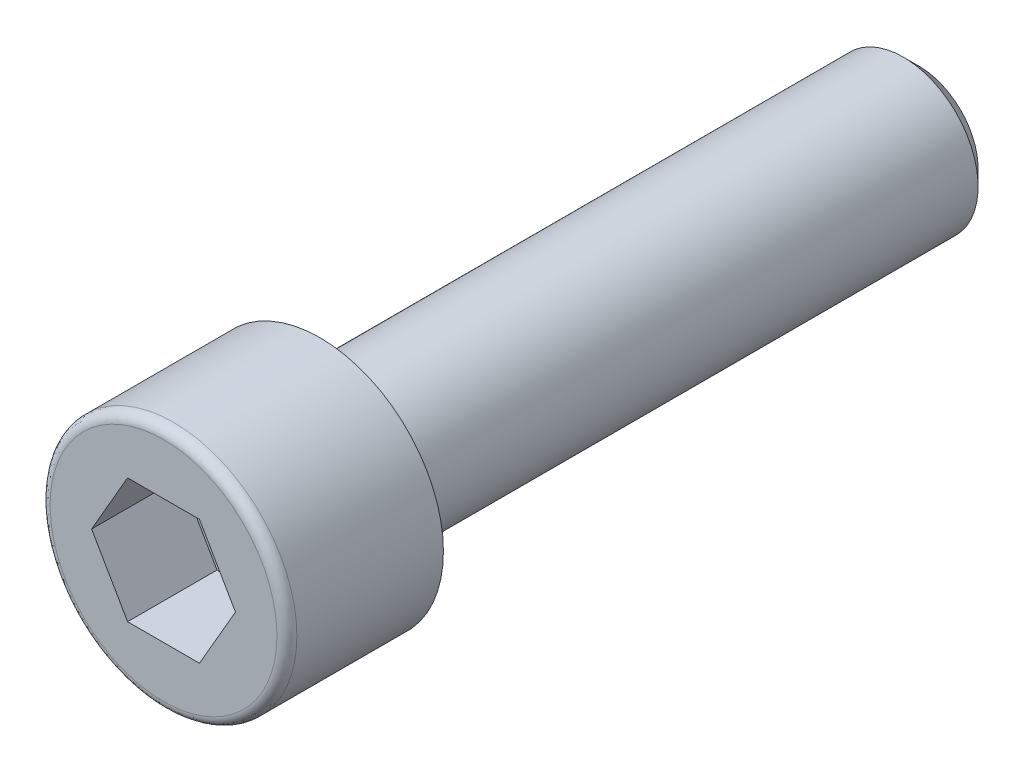
ISO-10303-21;
HEADER;
FILE_DESCRIPTION(('STEP AP214'),'2;1');
FILE_NAME('part.step','',(''),(''),'','','');
FILE_SCHEMA(('AUTOMOTIVE_DESIGN { 1 0 10303 214 1 1 1 1 }'));
ENDSEC;
DATA;
#1=APPLICATION_CONTEXT('core data for automotive mechanical design processes');
#2=APPLICATION_PROTOCOL_DEFINITION('international standard','automotive_design',2000,#1);
#3=PRODUCT_CONTEXT('',#1,'mechanical');
#4=PRODUCT('Part','Part','',(#3));
#5=PRODUCT_RELATED_PRODUCT_CATEGORY('part','',(#4));
#6=PRODUCT_DEFINITION_FORMATION('','',#4);
#7=PRODUCT_DEFINITION_CONTEXT('part definition',#1,'design');
#8=PRODUCT_DEFINITION('design','',#6,#7);
#9=PRODUCT_DEFINITION_SHAPE('','',#8);
#10=(LENGTH_UNIT() NAMED_UNIT(*) SI_UNIT(.MILLI.,.METRE.));
#11=(NAMED_UNIT(*) PLANE_ANGLE_UNIT() SI_UNIT($,.RADIAN.));
#12=(NAMED_UNIT(*) SI_UNIT($,.STERADIAN.) SOLID_ANGLE_UNIT());
#13=UNCERTAINTY_MEASURE_WITH_UNIT(LENGTH_MEASURE(1.E-05),#10,'distance_accuracy_value','');
#14=(GEOMETRIC_REPRESENTATION_CONTEXT(3) GLOBAL_UNCERTAINTY_ASSIGNED_CONTEXT((#13)) GLOBAL_UNIT_ASSIGNED_CONTEXT((#10,
#11,#12)) REPRESENTATION_CONTEXT('',''));
#15=CARTESIAN_POINT('',(0.,0.,0.));
#16=DIRECTION('',(0.,0.,1.));
#17=DIRECTION('',(1.,0.,0.));
#18=AXIS2_PLACEMENT_3D('',#15,#16,#17);
#19=CARTESIAN_POINT('',(0.,0.,-18.55));
#20=DIRECTION('',(0.,0.,1.));
#21=DIRECTION('',(1.,0.,0.));
#22=AXIS2_PLACEMENT_3D('',#19,#20,#21);
#23=CONICAL_SURFACE('',#22,2.38125,0.785398163397457);
#24=CARTESIAN_POINT('',(0.,0.,-19.05));
#25=DIRECTION('',(0.,0.,-1.));
#26=DIRECTION('',(-1.,0.,0.));
#27=AXIS2_PLACEMENT_3D('',#24,#25,#26);
#28=CIRCLE('',#27,1.88125);
#29=CARTESIAN_POINT('',(-1.88125,0.,-19.05));
#30=VERTEX_POINT('',#29);
#31=EDGE_CURVE('E122',#30,#30,#28,.T.);
#32=ORIENTED_EDGE('',*,*,#31,.F.);
#33=EDGE_LOOP('',(#32));
#34=FACE_BOUND('',#33,.T.);
#35=CARTESIAN_POINT('',(0.,0.,-18.55));
#36=DIRECTION('',(0.,0.,1.));
#37=DIRECTION('',(-1.,0.,0.));
#38=AXIS2_PLACEMENT_3D('',#35,#36,#37);
#39=CIRCLE('',#38,2.38125);
#40=CARTESIAN_POINT('',(-2.38125,0.,-18.55));
#41=VERTEX_POINT('',#40);
#42=EDGE_CURVE('E123',#41,#41,#39,.T.);
#43=ORIENTED_EDGE('',*,*,#42,.F.);
#44=EDGE_LOOP('',(#43));
#45=FACE_BOUND('',#44,.T.);
#46=ADVANCED_FACE('F16',(#34,#45),#23,.T.);
#47=CARTESIAN_POINT('',(0.,0.,2.1336));
#48=DIRECTION('',(0.,0.,1.));
#49=DIRECTION('',(1.,0.,0.));
#50=AXIS2_PLACEMENT_3D('',#47,#48,#49);
#51=PLANE('',#50);
#52=DIRECTION('',(1.,0.,0.));
#53=VECTOR('',#52,1.);
#54=CARTESIAN_POINT('',(1.14384635331847,1.9812,2.1336));
#55=LINE('',#54,#53);
#56=CARTESIAN_POINT('',(-1.14384635331851,1.98119999999997,2.1336));
#57=VERTEX_POINT('',#56);
#58=CARTESIAN_POINT('',(1.14384635331847,1.9812,2.1336));
#59=VERTEX_POINT('',#58);
#60=EDGE_CURVE('E134',#57,#59,#55,.T.);
#61=ORIENTED_EDGE('',*,*,#60,.F.);
#62=DIRECTION('',(0.5,0.866025403784439,0.));
#63=VECTOR('',#62,1.);
#64=CARTESIAN_POINT('',(-1.14384635331851,1.98119999999997,2.1336));
#65=LINE('',#64,#63);
#66=CARTESIAN_POINT('',(-2.28769270663698,0.,2.1336));
#67=VERTEX_POINT('',#66);
#68=EDGE_CURVE('E27',#67,#57,#65,.T.);
#69=ORIENTED_EDGE('',*,*,#68,.F.);
#70=DIRECTION('',(-0.5,0.866025403784439,0.));
#71=VECTOR('',#70,1.);
#72=CARTESIAN_POINT('',(-2.28769270663698,0.,2.1336));
#73=LINE('',#72,#71);
#74=CARTESIAN_POINT('',(-1.14384635331852,-1.9812,2.1336));
#75=VERTEX_POINT('',#74);
#76=EDGE_CURVE('E11',#75,#67,#73,.T.);
#77=ORIENTED_EDGE('',*,*,#76,.F.);
#78=DIRECTION('',(-1.,0.,0.));
#79=VECTOR('',#78,1.);
#80=CARTESIAN_POINT('',(-1.14384635331852,-1.9812,2.1336));
#81=LINE('',#80,#79);
#82=CARTESIAN_POINT('',(1.14384635331849,-1.9812,2.1336));
#83=VERTEX_POINT('',#82);
#84=EDGE_CURVE('E188',#83,#75,#81,.T.);
#85=ORIENTED_EDGE('',*,*,#84,.F.);
#86=DIRECTION('',(-0.5,-0.866025403784439,0.));
#87=VECTOR('',#86,1.);
#88=CARTESIAN_POINT('',(1.14384635331849,-1.9812,2.1336));
#89=LINE('',#88,#87);
#90=CARTESIAN_POINT('',(2.28769270663695,0.,2.1336));
#91=VERTEX_POINT('',#90);
#92=EDGE_CURVE('E146',#91,#83,#89,.T.);
#93=ORIENTED_EDGE('',*,*,#92,.F.);
#94=DIRECTION('',(0.5,-0.866025403784438,0.));
#95=VECTOR('',#94,1.);
#96=CARTESIAN_POINT('',(2.28769270663695,0.,2.1336));
#97=LINE('',#96,#95);
#98=EDGE_CURVE('E152',#59,#91,#97,.T.);
#99=ORIENTED_EDGE('',*,*,#98,.F.);
#100=EDGE_LOOP('',(#61,#69,#77,#85,#93,#99));
#101=FACE_BOUND('',#100,.T.);
#102=ADVANCED_FACE('F213',(#101),#51,.T.);
#103=CARTESIAN_POINT('',(-2.28769270663698,0.,4.9784));
#104=DIRECTION('',(0.866025403784439,0.5,0.));
#105=DIRECTION('',(0.,0.,-1.));
#106=AXIS2_PLACEMENT_3D('',#103,#104,#105);
#107=PLANE('',#106);
#108=DIRECTION('',(-0.5,0.866025403784438,0.));
#109=VECTOR('',#108,1.);
#110=CARTESIAN_POINT('',(-1.14384635331854,-1.9812,4.9784));
#111=LINE('',#110,#109);
#112=CARTESIAN_POINT('',(-1.14384635331854,-1.9812,4.9784));
#113=VERTEX_POINT('',#112);
#114=CARTESIAN_POINT('',(-2.28769270663698,0.,4.9784));
#115=VERTEX_POINT('',#114);
#116=EDGE_CURVE('E157',#113,#115,#111,.T.);
#117=ORIENTED_EDGE('',*,*,#116,.F.);
#118=DIRECTION('',(0.,0.,1.));
#119=VECTOR('',#118,1.);
#120=CARTESIAN_POINT('',(-1.14384635331854,-1.9812,4.9784));
#121=LINE('',#120,#119);
#122=EDGE_CURVE('E147',#75,#113,#121,.T.);
#123=ORIENTED_EDGE('',*,*,#122,.F.);
#124=ORIENTED_EDGE('',*,*,#76,.T.);
#125=DIRECTION('',(0.,0.,-1.));
#126=VECTOR('',#125,1.);
#127=CARTESIAN_POINT('',(-2.28769270663698,0.,4.9784));
#128=LINE('',#127,#126);
#129=EDGE_CURVE('E108',#115,#67,#128,.T.);
#130=ORIENTED_EDGE('',*,*,#129,.F.);
#131=EDGE_LOOP('',(#117,#123,#124,#130));
#132=FACE_BOUND('',#131,.T.);
#133=ADVANCED_FACE('F18',(#132),#107,.T.);
#134=CARTESIAN_POINT('',(-1.14384635331851,1.98119999999997,4.9784));
#135=DIRECTION('',(0.866025403784439,-0.5,0.));
#136=DIRECTION('',(0.,0.,-1.));
#137=AXIS2_PLACEMENT_3D('',#134,#135,#136);
#138=PLANE('',#137);
#139=DIRECTION('',(0.5,0.866025403784439,0.));
#140=VECTOR('',#139,1.);
#141=CARTESIAN_POINT('',(-2.28769270663698,0.,4.9784));
#142=LINE('',#141,#140);
#143=CARTESIAN_POINT('',(-1.1438463533185,1.9812,4.9784));
#144=VERTEX_POINT('',#143);
#145=EDGE_CURVE('E153',#115,#144,#142,.T.);
#146=ORIENTED_EDGE('',*,*,#145,.F.);
#147=ORIENTED_EDGE('',*,*,#129,.T.);
#148=ORIENTED_EDGE('',*,*,#68,.T.);
#149=DIRECTION('',(0.,0.,-1.));
#150=VECTOR('',#149,1.);
#151=CARTESIAN_POINT('',(-1.1438463533185,1.9812,4.9784));
#152=LINE('',#151,#150);
#153=EDGE_CURVE('E96',#144,#57,#152,.T.);
#154=ORIENTED_EDGE('',*,*,#153,.F.);
#155=EDGE_LOOP('',(#146,#147,#148,#154));
#156=FACE_BOUND('',#155,.T.);
#157=ADVANCED_FACE('F201',(#156),#138,.T.);
#158=CARTESIAN_POINT('',(1.14384635331848,1.98120000000002,4.9784));
#159=DIRECTION('',(0.,-1.,0.));
#160=DIRECTION('',(0.,0.,-1.));
#161=AXIS2_PLACEMENT_3D('',#158,#159,#160);
#162=PLANE('',#161);
#163=DIRECTION('',(1.,0.,0.));
#164=VECTOR('',#163,1.);
#165=CARTESIAN_POINT('',(0.,1.98120000000003,4.9784));
#166=LINE('',#165,#164);
#167=CARTESIAN_POINT('',(1.14384635331848,1.98120000000002,4.9784));
#168=VERTEX_POINT('',#167);
#169=EDGE_CURVE('E20',#144,#168,#166,.T.);
#170=ORIENTED_EDGE('',*,*,#169,.F.);
#171=ORIENTED_EDGE('',*,*,#153,.T.);
#172=ORIENTED_EDGE('',*,*,#60,.T.);
#173=DIRECTION('',(0.,0.,-1.));
#174=VECTOR('',#173,1.);
#175=CARTESIAN_POINT('',(1.14384635331848,1.98120000000002,4.9784));
#176=LINE('',#175,#174);
#177=EDGE_CURVE('E148',#168,#59,#176,.T.);
#178=ORIENTED_EDGE('',*,*,#177,.F.);
#179=EDGE_LOOP('',(#170,#171,#172,#178));
#180=FACE_BOUND('',#179,.T.);
#181=ADVANCED_FACE('F216',(#180),#162,.T.);
#182=CARTESIAN_POINT('',(2.28769270663693,0.,4.9784));
#183=DIRECTION('',(-0.866025403784438,-0.5,0.));
#184=DIRECTION('',(-0.5,0.866025403784438,0.));
#185=AXIS2_PLACEMENT_3D('',#182,#183,#184);
#186=PLANE('',#185);
#187=DIRECTION('',(0.5,-0.866025403784439,0.));
#188=VECTOR('',#187,1.);
#189=CARTESIAN_POINT('',(1.14384635331848,1.98120000000002,4.9784));
#190=LINE('',#189,#188);
#191=CARTESIAN_POINT('',(2.28769270663693,0.,4.9784));
#192=VERTEX_POINT('',#191);
#193=EDGE_CURVE('E178',#168,#192,#190,.T.);
#194=ORIENTED_EDGE('',*,*,#193,.F.);
#195=ORIENTED_EDGE('',*,*,#177,.T.);
#196=ORIENTED_EDGE('',*,*,#98,.T.);
#197=DIRECTION('',(0.,0.,-1.));
#198=VECTOR('',#197,1.);
#199=CARTESIAN_POINT('',(2.28769270663693,0.,4.9784));
#200=LINE('',#199,#198);
#201=EDGE_CURVE('E142',#192,#91,#200,.T.);
#202=ORIENTED_EDGE('',*,*,#201,.F.);
#203=EDGE_LOOP('',(#194,#195,#196,#202));
#204=FACE_BOUND('',#203,.T.);
#205=ADVANCED_FACE('F356',(#204),#186,.T.);
#206=CARTESIAN_POINT('',(1.14384635331848,-1.98119999999997,4.9784));
#207=DIRECTION('',(-0.866025403784439,0.5,0.));
#208=DIRECTION('',(0.,0.,1.));
#209=AXIS2_PLACEMENT_3D('',#206,#207,#208);
#210=PLANE('',#209);
#211=DIRECTION('',(-0.5,-0.866025403784439,0.));
#212=VECTOR('',#211,1.);
#213=CARTESIAN_POINT('',(2.28769270663693,0.,4.9784));
#214=LINE('',#213,#212);
#215=CARTESIAN_POINT('',(1.14384635331848,-1.98119999999997,4.9784));
#216=VERTEX_POINT('',#215);
#217=EDGE_CURVE('E158',#192,#216,#214,.T.);
#218=ORIENTED_EDGE('',*,*,#217,.F.);
#219=ORIENTED_EDGE('',*,*,#201,.T.);
#220=ORIENTED_EDGE('',*,*,#92,.T.);
#221=DIRECTION('',(0.,0.,-1.));
#222=VECTOR('',#221,1.);
#223=CARTESIAN_POINT('',(1.14384635331848,-1.98119999999997,4.9784));
#224=LINE('',#223,#222);
#225=EDGE_CURVE('E182',#216,#83,#224,.T.);
#226=ORIENTED_EDGE('',*,*,#225,.F.);
#227=EDGE_LOOP('',(#218,#219,#220,#226));
#228=FACE_BOUND('',#227,.T.);
#229=ADVANCED_FACE('F352',(#228),#210,.T.);
#230=CARTESIAN_POINT('',(-1.14384635331854,-1.9812,4.9784));
#231=DIRECTION('',(0.,1.,0.));
#232=DIRECTION('',(1.,0.,0.));
#233=AXIS2_PLACEMENT_3D('',#230,#231,#232);
#234=PLANE('',#233);
#235=DIRECTION('',(-1.,0.,0.));
#236=VECTOR('',#235,1.);
#237=CARTESIAN_POINT('',(0.,-1.9812,4.9784));
#238=LINE('',#237,#236);
#239=EDGE_CURVE('E162',#216,#113,#238,.T.);
#240=ORIENTED_EDGE('',*,*,#239,.F.);
#241=ORIENTED_EDGE('',*,*,#225,.T.);
#242=ORIENTED_EDGE('',*,*,#84,.T.);
#243=ORIENTED_EDGE('',*,*,#122,.T.);
#244=EDGE_LOOP('',(#240,#241,#242,#243));
#245=FACE_BOUND('',#244,.T.);
#246=ADVANCED_FACE('F210',(#245),#234,.T.);
#247=CARTESIAN_POINT('',(0.,0.,4.9784));
#248=DIRECTION('',(0.,0.,1.));
#249=DIRECTION('',(1.,0.,0.));
#250=AXIS2_PLACEMENT_3D('',#247,#248,#249);
#251=PLANE('',#250);
#252=ORIENTED_EDGE('',*,*,#217,.T.);
#253=ORIENTED_EDGE('',*,*,#239,.T.);
#254=ORIENTED_EDGE('',*,*,#116,.T.);
#255=ORIENTED_EDGE('',*,*,#145,.T.);
#256=ORIENTED_EDGE('',*,*,#169,.T.);
#257=ORIENTED_EDGE('',*,*,#193,.T.);
#258=EDGE_LOOP('',(#252,#253,#254,#255,#256,#257));
#259=FACE_BOUND('',#258,.T.);
#260=CARTESIAN_POINT('',(3.6068,0.,4.9784));
#261=CARTESIAN_POINT('',(3.60679999999998,-7.21360000000009,4.97840000000002));
#262=CARTESIAN_POINT('',(-3.60680000000011,-7.21360000000005,4.97840000000002));
#263=CARTESIAN_POINT('',(-3.60680000000006,0.,4.9784));
#264=CARTESIAN_POINT('',(-3.60680000000001,7.21360000000015,4.97840000000002));
#265=CARTESIAN_POINT('',(3.60680000000009,7.21360000000009,4.97840000000002));
#266=CARTESIAN_POINT('',(3.6068,0.,4.9784));
#267=(BOUNDED_CURVE() B_SPLINE_CURVE(3,(#260,#261,#262,#263,#264,#265,#266),.UNSPECIFIED.,.T.,
.F.) B_SPLINE_CURVE_WITH_KNOTS((4,3,4),(0.,0.5,1.),
.UNSPECIFIED.) CURVE() GEOMETRIC_REPRESENTATION_ITEM() RATIONAL_B_SPLINE_CURVE((1.,
0.333333333333334,0.333333333333334,1.,0.333333333333334,0.333333333333334,1.)) REPRESENTATION_ITEM(''));
#268=CARTESIAN_POINT('',(3.6068,0.,4.9784));
#269=VERTEX_POINT('',#268);
#270=EDGE_CURVE('E140',#269,#269,#267,.T.);
#271=ORIENTED_EDGE('',*,*,#270,.F.);
#272=EDGE_LOOP('',(#271));
#273=FACE_BOUND('',#272,.T.);
#274=ADVANCED_FACE('F205',(#259,#273),#251,.T.);
#275=CARTESIAN_POINT('',(0.,-3.9243,4.6609));
#276=CARTESIAN_POINT('',(-7.84860000000013,-3.9243,4.66090000000002));
#277=CARTESIAN_POINT('',(-7.8486,3.92430000000012,4.66090000000002));
#278=CARTESIAN_POINT('',(0.,3.92430000000008,4.6609));
#279=CARTESIAN_POINT('',(7.8486000000001,3.92430000000003,4.66090000000002));
#280=CARTESIAN_POINT('',(7.8486,-3.92430000000006,4.66090000000002));
#281=CARTESIAN_POINT('',(0.,-3.9243,4.6609));
#282=CARTESIAN_POINT('',(0.,-3.92430000000002,4.84688719394657));
#283=CARTESIAN_POINT('',(-7.84860000000015,-3.92429999999998,4.84688719394656));
#284=CARTESIAN_POINT('',(-7.84860000000011,3.92430000000012,4.84688719394657));
#285=CARTESIAN_POINT('',(0.,3.92430000000008,4.84688719394657));
#286=CARTESIAN_POINT('',(7.84860000000011,3.92430000000004,4.84688719394657));
#287=CARTESIAN_POINT('',(7.84860000000007,-3.92430000000007,4.84688719394657));
#288=CARTESIAN_POINT('',(0.,-3.92430000000002,4.84688719394657));
#289=CARTESIAN_POINT('',(0.,-3.79278719394656,4.97840000000003));
#290=CARTESIAN_POINT('',(-7.58557438789323,-3.79278719394653,4.97840000000002));
#291=CARTESIAN_POINT('',(-7.58557438789318,3.79278719394666,4.97840000000003));
#292=CARTESIAN_POINT('',(0.,3.79278719394662,4.97840000000003));
#293=CARTESIAN_POINT('',(7.5855743878932,3.79278719394658,4.97840000000003));
#294=CARTESIAN_POINT('',(7.58557438789316,-3.79278719394661,4.97840000000003));
#295=CARTESIAN_POINT('',(0.,-3.79278719394656,4.97840000000003));
#296=CARTESIAN_POINT('',(0.,-3.6068,4.9784));
#297=CARTESIAN_POINT('',(-7.21360000000012,-3.60679999999998,4.97840000000002));
#298=CARTESIAN_POINT('',(-7.21360000000009,3.60680000000012,4.97840000000002));
#299=CARTESIAN_POINT('',(0.,3.60680000000007,4.9784));
#300=CARTESIAN_POINT('',(7.21360000000011,3.60680000000003,4.97840000000002));
#301=CARTESIAN_POINT('',(7.21360000000006,-3.60680000000006,4.97840000000002));
#302=CARTESIAN_POINT('',(0.,-3.6068,4.9784));
#303=(BOUNDED_SURFACE() B_SPLINE_SURFACE(3,3,((#275,#276,#277,#278,#279,#280,#281),(#282,#283,
#284,#285,#286,#287,#288),(#289,#290,#291,#292,#293,#294,#295),(#296,#297,#298,#299,#300,#301,
#302)),.UNSPECIFIED.,.F.,.T.,.F.) B_SPLINE_SURFACE_WITH_KNOTS((4,4),(4,3,4),(0.,1.),(0.,0.5,1.),
.UNSPECIFIED.) GEOMETRIC_REPRESENTATION_ITEM() RATIONAL_B_SPLINE_SURFACE(((1.,0.333333333333334,
0.333333333333334,1.,0.333333333333334,0.333333333333334,1.),(0.804737854124364,
0.268245951374788,0.268245951374788,0.804737854124364,0.268245951374788,0.268245951374788,
0.804737854124364),(0.804737854124364,0.268245951374788,0.268245951374788,0.804737854124364,
0.268245951374788,0.268245951374788,0.804737854124364),(1.,0.333333333333334,0.333333333333334,
1.,0.333333333333334,0.333333333333334,1.))) REPRESENTATION_ITEM('') SURFACE());
#304=CARTESIAN_POINT('',(0.,0.,4.6609));
#305=DIRECTION('',(0.,0.,-1.));
#306=DIRECTION('',(1.,0.,0.));
#307=AXIS2_PLACEMENT_3D('',#304,#305,#306);
#308=CIRCLE('',#307,3.9243);
#309=CARTESIAN_POINT('',(3.9243,0.,4.6609));
#310=VERTEX_POINT('',#309);
#311=EDGE_CURVE('E129',#310,#310,#308,.T.);
#312=ORIENTED_EDGE('',*,*,#311,.F.);
#313=EDGE_LOOP('',(#312));
#314=FACE_BOUND('',#313,.T.);
#315=ORIENTED_EDGE('',*,*,#270,.T.);
#316=EDGE_LOOP('',(#315));
#317=FACE_BOUND('',#316,.T.);
#318=ADVANCED_FACE('F346',(#314,#317),#303,.T.);
#319=CARTESIAN_POINT('',(0.,0.,0.));
#320=DIRECTION('',(0.,0.,1.));
#321=DIRECTION('',(1.,0.,0.));
#322=AXIS2_PLACEMENT_3D('',#319,#320,#321);
#323=CYLINDRICAL_SURFACE('',#322,3.9243);
#324=ORIENTED_EDGE('',*,*,#311,.T.);
#325=EDGE_LOOP('',(#324));
#326=FACE_BOUND('',#325,.T.);
#327=CARTESIAN_POINT('',(0.,0.,0.));
#328=DIRECTION('',(0.,0.,-1.));
#329=DIRECTION('',(1.,0.,0.));
#330=AXIS2_PLACEMENT_3D('',#327,#328,#329);
#331=CIRCLE('',#330,3.9243);
#332=CARTESIAN_POINT('',(3.9243,0.,0.));
#333=VERTEX_POINT('',#332);
#334=EDGE_CURVE('E118',#333,#333,#331,.T.);
#335=ORIENTED_EDGE('',*,*,#334,.F.);
#336=EDGE_LOOP('',(#335));
#337=FACE_BOUND('',#336,.T.);
#338=ADVANCED_FACE('F341',(#326,#337),#323,.T.);
#339=CARTESIAN_POINT('',(0.,0.,-19.05));
#340=DIRECTION('',(0.,0.,-1.));
#341=DIRECTION('',(-1.,0.,0.));
#342=AXIS2_PLACEMENT_3D('',#339,#340,#341);
#343=PLANE('',#342);
#344=ORIENTED_EDGE('',*,*,#31,.T.);
#345=EDGE_LOOP('',(#344));
#346=FACE_BOUND('',#345,.T.);
#347=ADVANCED_FACE('F345',(#346),#343,.T.);
#348=CARTESIAN_POINT('',(0.,0.,0.));
#349=DIRECTION('',(0.,0.,-1.));
#350=DIRECTION('',(-1.,0.,0.));
#351=AXIS2_PLACEMENT_3D('',#348,#349,#350);
#352=PLANE('',#351);
#353=CARTESIAN_POINT('',(0.,0.,0.));
#354=DIRECTION('',(0.,0.,-1.));
#355=DIRECTION('',(-1.,0.,0.));
#356=AXIS2_PLACEMENT_3D('',#353,#354,#355);
#357=CIRCLE('',#356,2.38125);
#358=CARTESIAN_POINT('',(-2.38125,0.,0.));
#359=VERTEX_POINT('',#358);
#360=EDGE_CURVE('E131',#359,#359,#357,.T.);
#361=ORIENTED_EDGE('',*,*,#360,.F.);
#362=EDGE_LOOP('',(#361));
#363=FACE_BOUND('',#362,.T.);
#364=ORIENTED_EDGE('',*,*,#334,.T.);
#365=EDGE_LOOP('',(#364));
#366=FACE_BOUND('',#365,.T.);
#367=ADVANCED_FACE('F119',(#363,#366),#352,.T.);
#368=CARTESIAN_POINT('',(0.,0.,0.));
#369=DIRECTION('',(0.,0.,-1.));
#370=DIRECTION('',(-1.,0.,0.));
#371=AXIS2_PLACEMENT_3D('',#368,#369,#370);
#372=CYLINDRICAL_SURFACE('',#371,2.38125);
#373=ORIENTED_EDGE('',*,*,#42,.T.);
#374=EDGE_LOOP('',(#373));
#375=FACE_BOUND('',#374,.T.);
#376=ORIENTED_EDGE('',*,*,#360,.T.);
#377=EDGE_LOOP('',(#376));
#378=FACE_BOUND('',#377,.T.);
#379=ADVANCED_FACE('F402',(#375,#378),#372,.T.);
#380=CLOSED_SHELL('',(#46,#102,#133,#157,#181,#205,#229,#246,#274,#318,#338,#347,#367,#379));
#381=MANIFOLD_SOLID_BREP('B1',#380);
#382=ADVANCED_BREP_SHAPE_REPRESENTATION('',(#18,#381),#14);
#383=SHAPE_DEFINITION_REPRESENTATION(#9,#382);
ENDSEC;
END-ISO-10303-21;
